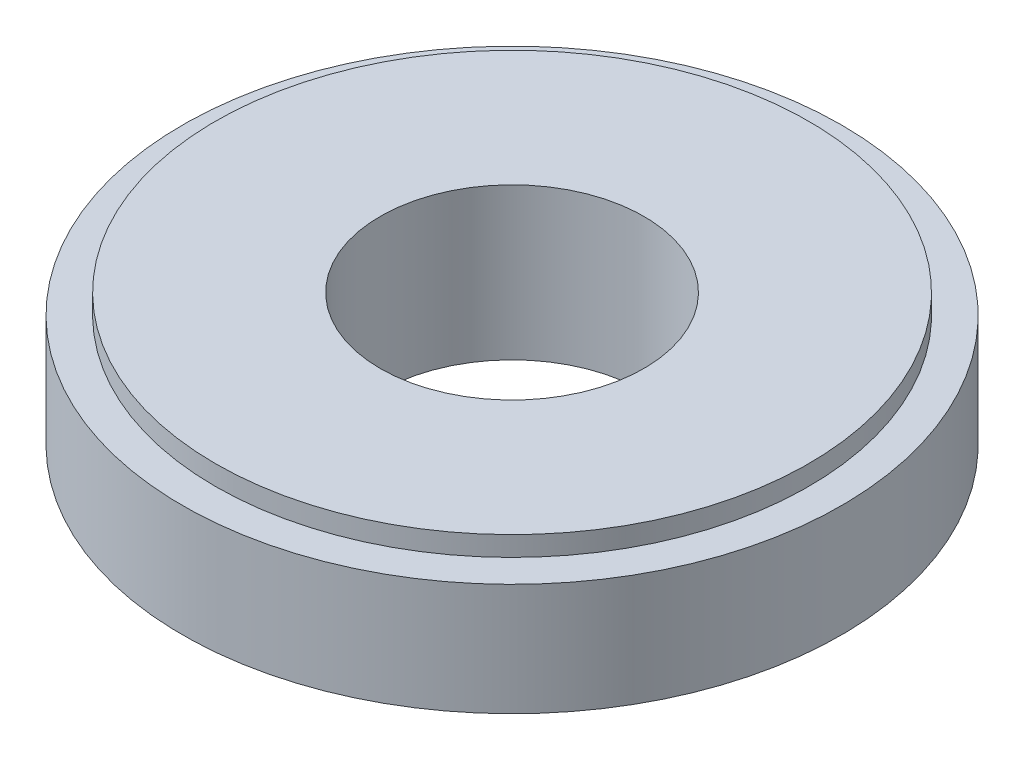
ISO-10303-21;
HEADER;
FILE_DESCRIPTION(('STEP AP214'),'2;1');
FILE_NAME('part.step','',(''),(''),'','','');
FILE_SCHEMA(('AUTOMOTIVE_DESIGN { 1 0 10303 214 1 1 1 1 }'));
ENDSEC;
DATA;
#1=APPLICATION_CONTEXT('core data for automotive mechanical design processes');
#2=APPLICATION_PROTOCOL_DEFINITION('international standard','automotive_design',2000,#1);
#3=PRODUCT_CONTEXT('',#1,'mechanical');
#4=PRODUCT('Part','Part','',(#3));
#5=PRODUCT_RELATED_PRODUCT_CATEGORY('part','',(#4));
#6=PRODUCT_DEFINITION_FORMATION('','',#4);
#7=PRODUCT_DEFINITION_CONTEXT('part definition',#1,'design');
#8=PRODUCT_DEFINITION('design','',#6,#7);
#9=PRODUCT_DEFINITION_SHAPE('','',#8);
#10=(LENGTH_UNIT() NAMED_UNIT(*) SI_UNIT(.MILLI.,.METRE.));
#11=(NAMED_UNIT(*) PLANE_ANGLE_UNIT() SI_UNIT($,.RADIAN.));
#12=(NAMED_UNIT(*) SI_UNIT($,.STERADIAN.) SOLID_ANGLE_UNIT());
#13=UNCERTAINTY_MEASURE_WITH_UNIT(LENGTH_MEASURE(1.E-05),#10,'distance_accuracy_value','');
#14=(GEOMETRIC_REPRESENTATION_CONTEXT(3) GLOBAL_UNCERTAINTY_ASSIGNED_CONTEXT((#13)) GLOBAL_UNIT_ASSIGNED_CONTEXT((#10,
#11,#12)) REPRESENTATION_CONTEXT('',''));
#15=CARTESIAN_POINT('',(0.,0.,0.));
#16=DIRECTION('',(0.,0.,1.));
#17=DIRECTION('',(1.,0.,0.));
#18=AXIS2_PLACEMENT_3D('',#15,#16,#17);
#19=CARTESIAN_POINT('',(0.,3.,0.));
#20=DIRECTION('',(0.,1.,0.));
#21=DIRECTION('',(0.,0.,1.));
#22=AXIS2_PLACEMENT_3D('',#19,#20,#21);
#23=PLANE('',#22);
#24=CARTESIAN_POINT('',(0.,3.,0.));
#25=DIRECTION('',(0.,-1.,0.));
#26=DIRECTION('',(0.,0.,-1.));
#27=AXIS2_PLACEMENT_3D('',#24,#25,#26);
#28=CIRCLE('',#27,30.);
#29=CARTESIAN_POINT('',(0.,3.,-30.));
#30=VERTEX_POINT('',#29);
#31=EDGE_CURVE('E17',#30,#30,#28,.T.);
#32=ORIENTED_EDGE('',*,*,#31,.F.);
#33=EDGE_LOOP('',(#32));
#34=FACE_BOUND('',#33,.T.);
#35=CARTESIAN_POINT('',(0.,3.,0.));
#36=DIRECTION('',(0.,-1.,0.));
#37=DIRECTION('',(0.,0.,-1.));
#38=AXIS2_PLACEMENT_3D('',#35,#36,#37);
#39=CIRCLE('',#38,50.);
#40=CARTESIAN_POINT('',(0.,3.,-50.));
#41=VERTEX_POINT('',#40);
#42=EDGE_CURVE('E39',#41,#41,#39,.F.);
#43=ORIENTED_EDGE('',*,*,#42,.F.);
#44=EDGE_LOOP('',(#43));
#45=FACE_BOUND('',#44,.T.);
#46=ADVANCED_FACE('F14',(#34,#45),#23,.F.);
#47=CARTESIAN_POINT('',(0.,3.,0.));
#48=DIRECTION('',(0.,-1.,0.));
#49=DIRECTION('',(0.,0.,-1.));
#50=AXIS2_PLACEMENT_3D('',#47,#48,#49);
#51=CYLINDRICAL_SURFACE('',#50,30.);
#52=ORIENTED_EDGE('',*,*,#31,.T.);
#53=EDGE_LOOP('',(#52));
#54=FACE_BOUND('',#53,.T.);
#55=CARTESIAN_POINT('',(0.,0.,0.));
#56=DIRECTION('',(0.,-1.,0.));
#57=DIRECTION('',(0.,0.,-1.));
#58=AXIS2_PLACEMENT_3D('',#55,#56,#57);
#59=CIRCLE('',#58,30.);
#60=CARTESIAN_POINT('',(0.,0.,-30.));
#61=VERTEX_POINT('',#60);
#62=EDGE_CURVE('E37',#61,#61,#59,.F.);
#63=ORIENTED_EDGE('',*,*,#62,.T.);
#64=EDGE_LOOP('',(#63));
#65=FACE_BOUND('',#64,.T.);
#66=ADVANCED_FACE('F46',(#54,#65),#51,.T.);
#67=CARTESIAN_POINT('',(0.,23.,0.));
#68=DIRECTION('',(0.,-1.,0.));
#69=DIRECTION('',(0.,0.,-1.));
#70=AXIS2_PLACEMENT_3D('',#67,#68,#69);
#71=CYLINDRICAL_SURFACE('',#70,50.);
#72=ORIENTED_EDGE('',*,*,#42,.T.);
#73=EDGE_LOOP('',(#72));
#74=FACE_BOUND('',#73,.T.);
#75=CARTESIAN_POINT('',(0.,20.,0.));
#76=DIRECTION('',(0.,-1.,0.));
#77=DIRECTION('',(0.,0.,-1.));
#78=AXIS2_PLACEMENT_3D('',#75,#76,#77);
#79=CIRCLE('',#78,50.);
#80=CARTESIAN_POINT('',(0.,20.,-50.));
#81=VERTEX_POINT('',#80);
#82=EDGE_CURVE('E34',#81,#81,#79,.F.);
#83=ORIENTED_EDGE('',*,*,#82,.F.);
#84=EDGE_LOOP('',(#83));
#85=FACE_BOUND('',#84,.T.);
#86=ADVANCED_FACE('F56',(#74,#85),#71,.T.);
#87=CARTESIAN_POINT('',(0.,0.,0.));
#88=DIRECTION('',(0.,1.,0.));
#89=DIRECTION('',(0.,0.,1.));
#90=AXIS2_PLACEMENT_3D('',#87,#88,#89);
#91=PLANE('',#90);
#92=ORIENTED_EDGE('',*,*,#62,.F.);
#93=EDGE_LOOP('',(#92));
#94=FACE_BOUND('',#93,.T.);
#95=CARTESIAN_POINT('',(0.,0.,0.));
#96=DIRECTION('',(0.,1.,0.));
#97=DIRECTION('',(0.,0.,1.));
#98=AXIS2_PLACEMENT_3D('',#95,#96,#97);
#99=CIRCLE('',#98,20.);
#100=CARTESIAN_POINT('',(0.,0.,20.));
#101=VERTEX_POINT('',#100);
#102=EDGE_CURVE('E31',#101,#101,#99,.T.);
#103=ORIENTED_EDGE('',*,*,#102,.T.);
#104=EDGE_LOOP('',(#103));
#105=FACE_BOUND('',#104,.T.);
#106=ADVANCED_FACE('F76',(#94,#105),#91,.F.);
#107=CARTESIAN_POINT('',(0.,20.,0.));
#108=DIRECTION('',(0.,1.,0.));
#109=DIRECTION('',(0.,0.,1.));
#110=AXIS2_PLACEMENT_3D('',#107,#108,#109);
#111=PLANE('',#110);
#112=ORIENTED_EDGE('',*,*,#82,.T.);
#113=EDGE_LOOP('',(#112));
#114=FACE_BOUND('',#113,.T.);
#115=CARTESIAN_POINT('',(0.,20.,0.));
#116=DIRECTION('',(0.,1.,0.));
#117=DIRECTION('',(0.,0.,1.));
#118=AXIS2_PLACEMENT_3D('',#115,#116,#117);
#119=CIRCLE('',#118,45.);
#120=CARTESIAN_POINT('',(0.,20.,45.));
#121=VERTEX_POINT('',#120);
#122=EDGE_CURVE('E26',#121,#121,#119,.T.);
#123=ORIENTED_EDGE('',*,*,#122,.F.);
#124=EDGE_LOOP('',(#123));
#125=FACE_BOUND('',#124,.T.);
#126=ADVANCED_FACE('F72',(#114,#125),#111,.T.);
#127=CARTESIAN_POINT('',(0.,0.,0.));
#128=DIRECTION('',(0.,1.,0.));
#129=DIRECTION('',(0.,0.,1.));
#130=AXIS2_PLACEMENT_3D('',#127,#128,#129);
#131=CYLINDRICAL_SURFACE('',#130,20.);
#132=CARTESIAN_POINT('',(0.,23.,0.));
#133=DIRECTION('',(0.,1.,0.));
#134=DIRECTION('',(0.,0.,1.));
#135=AXIS2_PLACEMENT_3D('',#132,#133,#134);
#136=CIRCLE('',#135,20.);
#137=CARTESIAN_POINT('',(0.,23.,20.));
#138=VERTEX_POINT('',#137);
#139=EDGE_CURVE('E21',#138,#138,#136,.F.);
#140=ORIENTED_EDGE('',*,*,#139,.F.);
#141=EDGE_LOOP('',(#140));
#142=FACE_BOUND('',#141,.T.);
#143=ORIENTED_EDGE('',*,*,#102,.F.);
#144=EDGE_LOOP('',(#143));
#145=FACE_BOUND('',#144,.T.);
#146=ADVANCED_FACE('F65',(#142,#145),#131,.F.);
#147=CARTESIAN_POINT('',(0.,20.,0.));
#148=DIRECTION('',(0.,1.,0.));
#149=DIRECTION('',(0.,0.,1.));
#150=AXIS2_PLACEMENT_3D('',#147,#148,#149);
#151=CYLINDRICAL_SURFACE('',#150,45.);
#152=ORIENTED_EDGE('',*,*,#122,.T.);
#153=EDGE_LOOP('',(#152));
#154=FACE_BOUND('',#153,.T.);
#155=CARTESIAN_POINT('',(0.,23.,0.));
#156=DIRECTION('',(0.,1.,0.));
#157=DIRECTION('',(0.,0.,1.));
#158=AXIS2_PLACEMENT_3D('',#155,#156,#157);
#159=CIRCLE('',#158,45.);
#160=CARTESIAN_POINT('',(0.,23.,45.));
#161=VERTEX_POINT('',#160);
#162=EDGE_CURVE('E10',#161,#161,#159,.T.);
#163=ORIENTED_EDGE('',*,*,#162,.F.);
#164=EDGE_LOOP('',(#163));
#165=FACE_BOUND('',#164,.T.);
#166=ADVANCED_FACE('F59',(#154,#165),#151,.T.);
#167=CARTESIAN_POINT('',(0.,23.,0.));
#168=DIRECTION('',(0.,1.,0.));
#169=DIRECTION('',(0.,0.,1.));
#170=AXIS2_PLACEMENT_3D('',#167,#168,#169);
#171=PLANE('',#170);
#172=ORIENTED_EDGE('',*,*,#162,.T.);
#173=EDGE_LOOP('',(#172));
#174=FACE_BOUND('',#173,.T.);
#175=ORIENTED_EDGE('',*,*,#139,.T.);
#176=EDGE_LOOP('',(#175));
#177=FACE_BOUND('',#176,.T.);
#178=ADVANCED_FACE('F57',(#174,#177),#171,.T.);
#179=CLOSED_SHELL('',(#46,#66,#86,#106,#126,#146,#166,#178));
#180=MANIFOLD_SOLID_BREP('B1',#179);
#181=ADVANCED_BREP_SHAPE_REPRESENTATION('',(#18,#180),#14);
#182=SHAPE_DEFINITION_REPRESENTATION(#9,#181);
ENDSEC;
END-ISO-10303-21;
